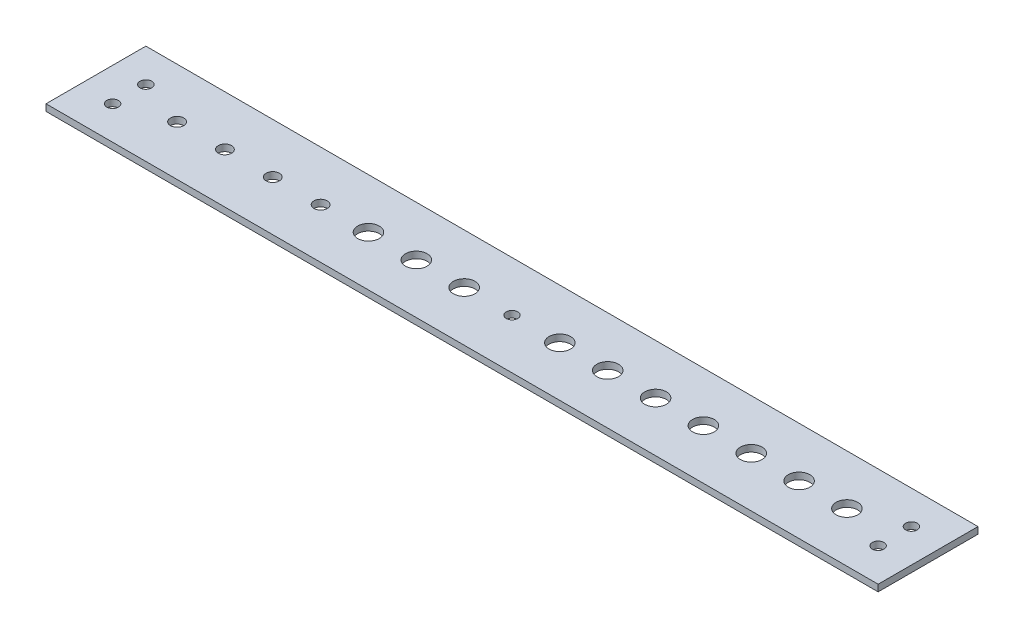
ISO-10303-21;
HEADER;
FILE_DESCRIPTION(('STEP AP214'),'2;1');
FILE_NAME('part.step','',(''),(''),'','','');
FILE_SCHEMA(('AUTOMOTIVE_DESIGN { 1 0 10303 214 1 1 1 1 }'));
ENDSEC;
DATA;
#1=APPLICATION_CONTEXT('core data for automotive mechanical design processes');
#2=APPLICATION_PROTOCOL_DEFINITION('international standard','automotive_design',2000,#1);
#3=PRODUCT_CONTEXT('',#1,'mechanical');
#4=PRODUCT('Part','Part','',(#3));
#5=PRODUCT_RELATED_PRODUCT_CATEGORY('part','',(#4));
#6=PRODUCT_DEFINITION_FORMATION('','',#4);
#7=PRODUCT_DEFINITION_CONTEXT('part definition',#1,'design');
#8=PRODUCT_DEFINITION('design','',#6,#7);
#9=PRODUCT_DEFINITION_SHAPE('','',#8);
#10=(LENGTH_UNIT() NAMED_UNIT(*) SI_UNIT(.MILLI.,.METRE.));
#11=(NAMED_UNIT(*) PLANE_ANGLE_UNIT() SI_UNIT($,.RADIAN.));
#12=(NAMED_UNIT(*) SI_UNIT($,.STERADIAN.) SOLID_ANGLE_UNIT());
#13=UNCERTAINTY_MEASURE_WITH_UNIT(LENGTH_MEASURE(1.E-05),#10,'distance_accuracy_value','');
#14=(GEOMETRIC_REPRESENTATION_CONTEXT(3) GLOBAL_UNCERTAINTY_ASSIGNED_CONTEXT((#13)) GLOBAL_UNIT_ASSIGNED_CONTEXT((#10,
#11,#12)) REPRESENTATION_CONTEXT('',''));
#15=CARTESIAN_POINT('',(0.,0.,0.));
#16=DIRECTION('',(0.,0.,1.));
#17=DIRECTION('',(1.,0.,0.));
#18=AXIS2_PLACEMENT_3D('',#15,#16,#17);
#19=CARTESIAN_POINT('',(-125.,2.,-15.));
#20=DIRECTION('',(0.,1.,0.));
#21=DIRECTION('',(0.,0.,1.));
#22=AXIS2_PLACEMENT_3D('',#19,#20,#21);
#23=PLANE('',#22);
#24=CARTESIAN_POINT('',(-14.375,2.,0.));
#25=DIRECTION('',(0.,1.,0.));
#26=DIRECTION('',(0.,0.,1.));
#27=AXIS2_PLACEMENT_3D('',#24,#25,#26);
#28=CIRCLE('',#27,3.25);
#29=CARTESIAN_POINT('',(-14.375,2.,3.25));
#30=VERTEX_POINT('',#29);
#31=EDGE_CURVE('E213',#30,#30,#28,.T.);
#32=ORIENTED_EDGE('',*,*,#31,.F.);
#33=EDGE_LOOP('',(#32));
#34=FACE_BOUND('',#33,.T.);
#35=CARTESIAN_POINT('',(-86.25,2.,0.));
#36=DIRECTION('',(0.,1.,0.));
#37=DIRECTION('',(0.,0.,1.));
#38=AXIS2_PLACEMENT_3D('',#35,#36,#37);
#39=CIRCLE('',#38,2.);
#40=CARTESIAN_POINT('',(-86.25,2.,2.));
#41=VERTEX_POINT('',#40);
#42=EDGE_CURVE('E201',#41,#41,#39,.T.);
#43=ORIENTED_EDGE('',*,*,#42,.F.);
#44=EDGE_LOOP('',(#43));
#45=FACE_BOUND('',#44,.T.);
#46=CARTESIAN_POINT('',(100.625,2.,0.));
#47=DIRECTION('',(0.,1.,0.));
#48=DIRECTION('',(0.,0.,1.));
#49=AXIS2_PLACEMENT_3D('',#46,#47,#48);
#50=CIRCLE('',#49,3.25000000000001);
#51=CARTESIAN_POINT('',(100.625,2.,3.25000000000001));
#52=VERTEX_POINT('',#51);
#53=EDGE_CURVE('E189',#52,#52,#50,.T.);
#54=ORIENTED_EDGE('',*,*,#53,.F.);
#55=EDGE_LOOP('',(#54));
#56=FACE_BOUND('',#55,.T.);
#57=CARTESIAN_POINT('',(71.875,2.,0.));
#58=DIRECTION('',(0.,1.,0.));
#59=DIRECTION('',(0.,0.,1.));
#60=AXIS2_PLACEMENT_3D('',#57,#58,#59);
#61=CIRCLE('',#60,3.25000000000001);
#62=CARTESIAN_POINT('',(71.875,2.,3.25000000000001));
#63=VERTEX_POINT('',#62);
#64=EDGE_CURVE('E177',#63,#63,#61,.T.);
#65=ORIENTED_EDGE('',*,*,#64,.F.);
#66=EDGE_LOOP('',(#65));
#67=FACE_BOUND('',#66,.T.);
#68=CARTESIAN_POINT('',(43.125,2.,0.));
#69=DIRECTION('',(0.,1.,0.));
#70=DIRECTION('',(0.,0.,1.));
#71=AXIS2_PLACEMENT_3D('',#68,#69,#70);
#72=CIRCLE('',#71,3.25);
#73=CARTESIAN_POINT('',(43.125,2.,3.25));
#74=VERTEX_POINT('',#73);
#75=EDGE_CURVE('E165',#74,#74,#72,.T.);
#76=ORIENTED_EDGE('',*,*,#75,.F.);
#77=EDGE_LOOP('',(#76));
#78=FACE_BOUND('',#77,.T.);
#79=CARTESIAN_POINT('',(-57.5,2.,0.));
#80=DIRECTION('',(0.,1.,0.));
#81=DIRECTION('',(0.,0.,1.));
#82=AXIS2_PLACEMENT_3D('',#79,#80,#81);
#83=CIRCLE('',#82,2.);
#84=CARTESIAN_POINT('',(-57.5,2.,2.));
#85=VERTEX_POINT('',#84);
#86=EDGE_CURVE('E153',#85,#85,#83,.T.);
#87=ORIENTED_EDGE('',*,*,#86,.F.);
#88=EDGE_LOOP('',(#87));
#89=FACE_BOUND('',#88,.T.);
#90=CARTESIAN_POINT('',(-100.625,2.,0.));
#91=DIRECTION('',(0.,1.,0.));
#92=DIRECTION('',(0.,0.,1.));
#93=AXIS2_PLACEMENT_3D('',#90,#91,#92);
#94=CIRCLE('',#93,2.);
#95=CARTESIAN_POINT('',(-100.625,2.,2.));
#96=VERTEX_POINT('',#95);
#97=EDGE_CURVE('E141',#96,#96,#94,.T.);
#98=ORIENTED_EDGE('',*,*,#97,.F.);
#99=EDGE_LOOP('',(#98));
#100=FACE_BOUND('',#99,.T.);
#101=CARTESIAN_POINT('',(115.,2.,-4.99999999999998));
#102=DIRECTION('',(0.,1.,0.));
#103=DIRECTION('',(0.,0.,1.));
#104=AXIS2_PLACEMENT_3D('',#101,#102,#103);
#105=CIRCLE('',#104,1.75);
#106=CARTESIAN_POINT('',(115.,2.,-3.24999999999999));
#107=VERTEX_POINT('',#106);
#108=EDGE_CURVE('E129',#107,#107,#105,.T.);
#109=ORIENTED_EDGE('',*,*,#108,.F.);
#110=EDGE_LOOP('',(#109));
#111=FACE_BOUND('',#110,.T.);
#112=CARTESIAN_POINT('',(-115.,2.,5.00000000000002));
#113=DIRECTION('',(0.,1.,0.));
#114=DIRECTION('',(0.,0.,1.));
#115=AXIS2_PLACEMENT_3D('',#112,#113,#114);
#116=CIRCLE('',#115,1.75);
#117=CARTESIAN_POINT('',(-115.,2.,6.75000000000001));
#118=VERTEX_POINT('',#117);
#119=EDGE_CURVE('E117',#118,#118,#116,.T.);
#120=ORIENTED_EDGE('',*,*,#119,.F.);
#121=EDGE_LOOP('',(#120));
#122=FACE_BOUND('',#121,.T.);
#123=DIRECTION('',(0.,0.,1.));
#124=VECTOR('',#123,1.);
#125=CARTESIAN_POINT('',(-125.,2.,15.));
#126=LINE('',#125,#124);
#127=CARTESIAN_POINT('',(-125.,2.,-15.));
#128=VERTEX_POINT('',#127);
#129=CARTESIAN_POINT('',(-125.,2.,15.));
#130=VERTEX_POINT('',#129);
#131=EDGE_CURVE('E87',#128,#130,#126,.T.);
#132=ORIENTED_EDGE('',*,*,#131,.T.);
#133=DIRECTION('',(1.,0.,0.));
#134=VECTOR('',#133,1.);
#135=CARTESIAN_POINT('',(125.,2.,15.));
#136=LINE('',#135,#134);
#137=CARTESIAN_POINT('',(125.,2.,15.));
#138=VERTEX_POINT('',#137);
#139=EDGE_CURVE('E82',#130,#138,#136,.T.);
#140=ORIENTED_EDGE('',*,*,#139,.T.);
#141=DIRECTION('',(0.,0.,-1.));
#142=VECTOR('',#141,1.);
#143=CARTESIAN_POINT('',(125.,2.,15.));
#144=LINE('',#143,#142);
#145=CARTESIAN_POINT('',(125.,2.,-15.));
#146=VERTEX_POINT('',#145);
#147=EDGE_CURVE('E85',#138,#146,#144,.T.);
#148=ORIENTED_EDGE('',*,*,#147,.T.);
#149=DIRECTION('',(-1.,0.,0.));
#150=VECTOR('',#149,1.);
#151=CARTESIAN_POINT('',(125.,2.,-15.));
#152=LINE('',#151,#150);
#153=EDGE_CURVE('E52',#146,#128,#152,.T.);
#154=ORIENTED_EDGE('',*,*,#153,.T.);
#155=EDGE_LOOP('',(#132,#140,#148,#154));
#156=FACE_BOUND('',#155,.T.);
#157=CARTESIAN_POINT('',(-115.,2.,-4.99999999999998));
#158=DIRECTION('',(0.,1.,0.));
#159=DIRECTION('',(0.,0.,1.));
#160=AXIS2_PLACEMENT_3D('',#157,#158,#159);
#161=CIRCLE('',#160,1.75);
#162=CARTESIAN_POINT('',(-115.,2.,-3.24999999999999));
#163=VERTEX_POINT('',#162);
#164=EDGE_CURVE('E102',#163,#163,#161,.T.);
#165=ORIENTED_EDGE('',*,*,#164,.F.);
#166=EDGE_LOOP('',(#165));
#167=FACE_BOUND('',#166,.T.);
#168=CARTESIAN_POINT('',(0.,2.,0.));
#169=DIRECTION('',(0.,1.,0.));
#170=DIRECTION('',(0.,0.,1.));
#171=AXIS2_PLACEMENT_3D('',#168,#169,#170);
#172=CIRCLE('',#171,1.75);
#173=CARTESIAN_POINT('',(0.,2.,1.75));
#174=VERTEX_POINT('',#173);
#175=EDGE_CURVE('E123',#174,#174,#172,.T.);
#176=ORIENTED_EDGE('',*,*,#175,.F.);
#177=EDGE_LOOP('',(#176));
#178=FACE_BOUND('',#177,.T.);
#179=CARTESIAN_POINT('',(115.,2.,5.00000000000002));
#180=DIRECTION('',(0.,1.,0.));
#181=DIRECTION('',(0.,0.,1.));
#182=AXIS2_PLACEMENT_3D('',#179,#180,#181);
#183=CIRCLE('',#182,1.75);
#184=CARTESIAN_POINT('',(115.,2.,6.75000000000001));
#185=VERTEX_POINT('',#184);
#186=EDGE_CURVE('E135',#185,#185,#183,.T.);
#187=ORIENTED_EDGE('',*,*,#186,.F.);
#188=EDGE_LOOP('',(#187));
#189=FACE_BOUND('',#188,.T.);
#190=CARTESIAN_POINT('',(-71.875,2.,0.));
#191=DIRECTION('',(0.,1.,0.));
#192=DIRECTION('',(0.,0.,1.));
#193=AXIS2_PLACEMENT_3D('',#190,#191,#192);
#194=CIRCLE('',#193,2.);
#195=CARTESIAN_POINT('',(-71.875,2.,2.));
#196=VERTEX_POINT('',#195);
#197=EDGE_CURVE('E147',#196,#196,#194,.T.);
#198=ORIENTED_EDGE('',*,*,#197,.F.);
#199=EDGE_LOOP('',(#198));
#200=FACE_BOUND('',#199,.T.);
#201=CARTESIAN_POINT('',(14.375,2.,0.));
#202=DIRECTION('',(0.,1.,0.));
#203=DIRECTION('',(0.,0.,1.));
#204=AXIS2_PLACEMENT_3D('',#201,#202,#203);
#205=CIRCLE('',#204,3.25);
#206=CARTESIAN_POINT('',(14.375,2.,3.25));
#207=VERTEX_POINT('',#206);
#208=EDGE_CURVE('E159',#207,#207,#205,.T.);
#209=ORIENTED_EDGE('',*,*,#208,.F.);
#210=EDGE_LOOP('',(#209));
#211=FACE_BOUND('',#210,.T.);
#212=CARTESIAN_POINT('',(57.5,2.,0.));
#213=DIRECTION('',(0.,1.,0.));
#214=DIRECTION('',(0.,0.,1.));
#215=AXIS2_PLACEMENT_3D('',#212,#213,#214);
#216=CIRCLE('',#215,3.25000000000001);
#217=CARTESIAN_POINT('',(57.5,2.,3.25000000000001));
#218=VERTEX_POINT('',#217);
#219=EDGE_CURVE('E171',#218,#218,#216,.T.);
#220=ORIENTED_EDGE('',*,*,#219,.F.);
#221=EDGE_LOOP('',(#220));
#222=FACE_BOUND('',#221,.T.);
#223=CARTESIAN_POINT('',(86.25,2.,0.));
#224=DIRECTION('',(0.,1.,0.));
#225=DIRECTION('',(0.,0.,1.));
#226=AXIS2_PLACEMENT_3D('',#223,#224,#225);
#227=CIRCLE('',#226,3.25000000000001);
#228=CARTESIAN_POINT('',(86.25,2.,3.25000000000001));
#229=VERTEX_POINT('',#228);
#230=EDGE_CURVE('E183',#229,#229,#227,.T.);
#231=ORIENTED_EDGE('',*,*,#230,.F.);
#232=EDGE_LOOP('',(#231));
#233=FACE_BOUND('',#232,.T.);
#234=CARTESIAN_POINT('',(-43.125,2.,0.));
#235=DIRECTION('',(0.,1.,0.));
#236=DIRECTION('',(0.,0.,1.));
#237=AXIS2_PLACEMENT_3D('',#234,#235,#236);
#238=CIRCLE('',#237,3.25);
#239=CARTESIAN_POINT('',(-43.125,2.,3.25));
#240=VERTEX_POINT('',#239);
#241=EDGE_CURVE('E195',#240,#240,#238,.T.);
#242=ORIENTED_EDGE('',*,*,#241,.F.);
#243=EDGE_LOOP('',(#242));
#244=FACE_BOUND('',#243,.T.);
#245=CARTESIAN_POINT('',(-28.75,2.,0.));
#246=DIRECTION('',(0.,1.,0.));
#247=DIRECTION('',(0.,0.,1.));
#248=AXIS2_PLACEMENT_3D('',#245,#246,#247);
#249=CIRCLE('',#248,3.25);
#250=CARTESIAN_POINT('',(-28.75,2.,3.25));
#251=VERTEX_POINT('',#250);
#252=EDGE_CURVE('E207',#251,#251,#249,.T.);
#253=ORIENTED_EDGE('',*,*,#252,.F.);
#254=EDGE_LOOP('',(#253));
#255=FACE_BOUND('',#254,.T.);
#256=CARTESIAN_POINT('',(28.75,2.,0.));
#257=DIRECTION('',(0.,1.,0.));
#258=DIRECTION('',(0.,0.,1.));
#259=AXIS2_PLACEMENT_3D('',#256,#257,#258);
#260=CIRCLE('',#259,3.25);
#261=CARTESIAN_POINT('',(28.75,2.,3.25));
#262=VERTEX_POINT('',#261);
#263=EDGE_CURVE('E219',#262,#262,#260,.T.);
#264=ORIENTED_EDGE('',*,*,#263,.F.);
#265=EDGE_LOOP('',(#264));
#266=FACE_BOUND('',#265,.T.);
#267=ADVANCED_FACE('F35',(#34,#45,#56,#67,#78,#89,#100,#111,#122,#156,#167,#178,#189,#200,#211,
#222,#233,#244,#255,#266),#23,.T.);
#268=CARTESIAN_POINT('',(-125.,0.,-15.));
#269=DIRECTION('',(0.,1.,0.));
#270=DIRECTION('',(0.,0.,1.));
#271=AXIS2_PLACEMENT_3D('',#268,#269,#270);
#272=PLANE('',#271);
#273=CARTESIAN_POINT('',(-14.375,0.,0.));
#274=DIRECTION('',(0.,1.,0.));
#275=DIRECTION('',(0.,0.,1.));
#276=AXIS2_PLACEMENT_3D('',#273,#274,#275);
#277=CIRCLE('',#276,3.25);
#278=CARTESIAN_POINT('',(-14.375,0.,3.25));
#279=VERTEX_POINT('',#278);
#280=EDGE_CURVE('E216',#279,#279,#277,.T.);
#281=ORIENTED_EDGE('',*,*,#280,.T.);
#282=EDGE_LOOP('',(#281));
#283=FACE_BOUND('',#282,.T.);
#284=CARTESIAN_POINT('',(-86.25,0.,0.));
#285=DIRECTION('',(0.,1.,0.));
#286=DIRECTION('',(0.,0.,1.));
#287=AXIS2_PLACEMENT_3D('',#284,#285,#286);
#288=CIRCLE('',#287,2.);
#289=CARTESIAN_POINT('',(-86.25,0.,2.));
#290=VERTEX_POINT('',#289);
#291=EDGE_CURVE('E204',#290,#290,#288,.T.);
#292=ORIENTED_EDGE('',*,*,#291,.T.);
#293=EDGE_LOOP('',(#292));
#294=FACE_BOUND('',#293,.T.);
#295=CARTESIAN_POINT('',(100.625,0.,0.));
#296=DIRECTION('',(0.,1.,0.));
#297=DIRECTION('',(0.,0.,1.));
#298=AXIS2_PLACEMENT_3D('',#295,#296,#297);
#299=CIRCLE('',#298,3.25000000000001);
#300=CARTESIAN_POINT('',(100.625,0.,3.25000000000001));
#301=VERTEX_POINT('',#300);
#302=EDGE_CURVE('E192',#301,#301,#299,.T.);
#303=ORIENTED_EDGE('',*,*,#302,.T.);
#304=EDGE_LOOP('',(#303));
#305=FACE_BOUND('',#304,.T.);
#306=CARTESIAN_POINT('',(71.875,0.,0.));
#307=DIRECTION('',(0.,1.,0.));
#308=DIRECTION('',(0.,0.,1.));
#309=AXIS2_PLACEMENT_3D('',#306,#307,#308);
#310=CIRCLE('',#309,3.25000000000001);
#311=CARTESIAN_POINT('',(71.875,0.,3.25000000000001));
#312=VERTEX_POINT('',#311);
#313=EDGE_CURVE('E180',#312,#312,#310,.T.);
#314=ORIENTED_EDGE('',*,*,#313,.T.);
#315=EDGE_LOOP('',(#314));
#316=FACE_BOUND('',#315,.T.);
#317=CARTESIAN_POINT('',(43.125,0.,0.));
#318=DIRECTION('',(0.,1.,0.));
#319=DIRECTION('',(0.,0.,1.));
#320=AXIS2_PLACEMENT_3D('',#317,#318,#319);
#321=CIRCLE('',#320,3.25);
#322=CARTESIAN_POINT('',(43.125,0.,3.25));
#323=VERTEX_POINT('',#322);
#324=EDGE_CURVE('E168',#323,#323,#321,.T.);
#325=ORIENTED_EDGE('',*,*,#324,.T.);
#326=EDGE_LOOP('',(#325));
#327=FACE_BOUND('',#326,.T.);
#328=CARTESIAN_POINT('',(-57.5,0.,0.));
#329=DIRECTION('',(0.,1.,0.));
#330=DIRECTION('',(0.,0.,1.));
#331=AXIS2_PLACEMENT_3D('',#328,#329,#330);
#332=CIRCLE('',#331,2.);
#333=CARTESIAN_POINT('',(-57.5,0.,2.));
#334=VERTEX_POINT('',#333);
#335=EDGE_CURVE('E156',#334,#334,#332,.T.);
#336=ORIENTED_EDGE('',*,*,#335,.T.);
#337=EDGE_LOOP('',(#336));
#338=FACE_BOUND('',#337,.T.);
#339=CARTESIAN_POINT('',(-100.625,0.,0.));
#340=DIRECTION('',(0.,1.,0.));
#341=DIRECTION('',(0.,0.,1.));
#342=AXIS2_PLACEMENT_3D('',#339,#340,#341);
#343=CIRCLE('',#342,2.);
#344=CARTESIAN_POINT('',(-100.625,0.,2.));
#345=VERTEX_POINT('',#344);
#346=EDGE_CURVE('E144',#345,#345,#343,.T.);
#347=ORIENTED_EDGE('',*,*,#346,.T.);
#348=EDGE_LOOP('',(#347));
#349=FACE_BOUND('',#348,.T.);
#350=CARTESIAN_POINT('',(115.,0.,-4.99999999999998));
#351=DIRECTION('',(0.,1.,0.));
#352=DIRECTION('',(0.,0.,1.));
#353=AXIS2_PLACEMENT_3D('',#350,#351,#352);
#354=CIRCLE('',#353,1.75);
#355=CARTESIAN_POINT('',(115.,0.,-3.24999999999999));
#356=VERTEX_POINT('',#355);
#357=EDGE_CURVE('E132',#356,#356,#354,.T.);
#358=ORIENTED_EDGE('',*,*,#357,.T.);
#359=EDGE_LOOP('',(#358));
#360=FACE_BOUND('',#359,.T.);
#361=CARTESIAN_POINT('',(-115.,0.,5.00000000000002));
#362=DIRECTION('',(0.,1.,0.));
#363=DIRECTION('',(0.,0.,1.));
#364=AXIS2_PLACEMENT_3D('',#361,#362,#363);
#365=CIRCLE('',#364,1.75);
#366=CARTESIAN_POINT('',(-115.,0.,6.75000000000001));
#367=VERTEX_POINT('',#366);
#368=EDGE_CURVE('E120',#367,#367,#365,.T.);
#369=ORIENTED_EDGE('',*,*,#368,.T.);
#370=EDGE_LOOP('',(#369));
#371=FACE_BOUND('',#370,.T.);
#372=DIRECTION('',(0.,0.,1.));
#373=VECTOR('',#372,1.);
#374=CARTESIAN_POINT('',(-125.,0.,15.));
#375=LINE('',#374,#373);
#376=CARTESIAN_POINT('',(-125.,0.,-15.));
#377=VERTEX_POINT('',#376);
#378=CARTESIAN_POINT('',(-125.,0.,15.));
#379=VERTEX_POINT('',#378);
#380=EDGE_CURVE('E99',#377,#379,#375,.T.);
#381=ORIENTED_EDGE('',*,*,#380,.F.);
#382=DIRECTION('',(-1.,0.,0.));
#383=VECTOR('',#382,1.);
#384=CARTESIAN_POINT('',(125.,0.,-15.));
#385=LINE('',#384,#383);
#386=CARTESIAN_POINT('',(125.,0.,-15.));
#387=VERTEX_POINT('',#386);
#388=EDGE_CURVE('E75',#387,#377,#385,.T.);
#389=ORIENTED_EDGE('',*,*,#388,.F.);
#390=DIRECTION('',(0.,0.,-1.));
#391=VECTOR('',#390,1.);
#392=CARTESIAN_POINT('',(125.,0.,15.));
#393=LINE('',#392,#391);
#394=CARTESIAN_POINT('',(125.,0.,15.));
#395=VERTEX_POINT('',#394);
#396=EDGE_CURVE('E69',#395,#387,#393,.T.);
#397=ORIENTED_EDGE('',*,*,#396,.F.);
#398=DIRECTION('',(1.,0.,0.));
#399=VECTOR('',#398,1.);
#400=CARTESIAN_POINT('',(125.,0.,15.));
#401=LINE('',#400,#399);
#402=EDGE_CURVE('E91',#379,#395,#401,.T.);
#403=ORIENTED_EDGE('',*,*,#402,.F.);
#404=EDGE_LOOP('',(#381,#389,#397,#403));
#405=FACE_BOUND('',#404,.T.);
#406=CARTESIAN_POINT('',(-115.,0.,-4.99999999999998));
#407=DIRECTION('',(0.,1.,0.));
#408=DIRECTION('',(0.,0.,1.));
#409=AXIS2_PLACEMENT_3D('',#406,#407,#408);
#410=CIRCLE('',#409,1.75);
#411=CARTESIAN_POINT('',(-115.,0.,-3.24999999999999));
#412=VERTEX_POINT('',#411);
#413=EDGE_CURVE('E114',#412,#412,#410,.T.);
#414=ORIENTED_EDGE('',*,*,#413,.T.);
#415=EDGE_LOOP('',(#414));
#416=FACE_BOUND('',#415,.T.);
#417=CARTESIAN_POINT('',(0.,0.,0.));
#418=DIRECTION('',(0.,1.,0.));
#419=DIRECTION('',(0.,0.,1.));
#420=AXIS2_PLACEMENT_3D('',#417,#418,#419);
#421=CIRCLE('',#420,1.75);
#422=CARTESIAN_POINT('',(0.,0.,1.75));
#423=VERTEX_POINT('',#422);
#424=EDGE_CURVE('E126',#423,#423,#421,.T.);
#425=ORIENTED_EDGE('',*,*,#424,.T.);
#426=EDGE_LOOP('',(#425));
#427=FACE_BOUND('',#426,.T.);
#428=CARTESIAN_POINT('',(115.,0.,5.00000000000002));
#429=DIRECTION('',(0.,1.,0.));
#430=DIRECTION('',(0.,0.,1.));
#431=AXIS2_PLACEMENT_3D('',#428,#429,#430);
#432=CIRCLE('',#431,1.75);
#433=CARTESIAN_POINT('',(115.,0.,6.75000000000001));
#434=VERTEX_POINT('',#433);
#435=EDGE_CURVE('E138',#434,#434,#432,.T.);
#436=ORIENTED_EDGE('',*,*,#435,.T.);
#437=EDGE_LOOP('',(#436));
#438=FACE_BOUND('',#437,.T.);
#439=CARTESIAN_POINT('',(-71.875,0.,0.));
#440=DIRECTION('',(0.,1.,0.));
#441=DIRECTION('',(0.,0.,1.));
#442=AXIS2_PLACEMENT_3D('',#439,#440,#441);
#443=CIRCLE('',#442,2.);
#444=CARTESIAN_POINT('',(-71.875,0.,2.));
#445=VERTEX_POINT('',#444);
#446=EDGE_CURVE('E150',#445,#445,#443,.T.);
#447=ORIENTED_EDGE('',*,*,#446,.T.);
#448=EDGE_LOOP('',(#447));
#449=FACE_BOUND('',#448,.T.);
#450=CARTESIAN_POINT('',(14.375,0.,0.));
#451=DIRECTION('',(0.,1.,0.));
#452=DIRECTION('',(0.,0.,1.));
#453=AXIS2_PLACEMENT_3D('',#450,#451,#452);
#454=CIRCLE('',#453,3.25);
#455=CARTESIAN_POINT('',(14.375,0.,3.25));
#456=VERTEX_POINT('',#455);
#457=EDGE_CURVE('E162',#456,#456,#454,.T.);
#458=ORIENTED_EDGE('',*,*,#457,.T.);
#459=EDGE_LOOP('',(#458));
#460=FACE_BOUND('',#459,.T.);
#461=CARTESIAN_POINT('',(57.5,0.,0.));
#462=DIRECTION('',(0.,1.,0.));
#463=DIRECTION('',(0.,0.,1.));
#464=AXIS2_PLACEMENT_3D('',#461,#462,#463);
#465=CIRCLE('',#464,3.25000000000001);
#466=CARTESIAN_POINT('',(57.5,0.,3.25000000000001));
#467=VERTEX_POINT('',#466);
#468=EDGE_CURVE('E174',#467,#467,#465,.T.);
#469=ORIENTED_EDGE('',*,*,#468,.T.);
#470=EDGE_LOOP('',(#469));
#471=FACE_BOUND('',#470,.T.);
#472=CARTESIAN_POINT('',(86.25,0.,0.));
#473=DIRECTION('',(0.,1.,0.));
#474=DIRECTION('',(0.,0.,1.));
#475=AXIS2_PLACEMENT_3D('',#472,#473,#474);
#476=CIRCLE('',#475,3.25000000000001);
#477=CARTESIAN_POINT('',(86.25,0.,3.25000000000001));
#478=VERTEX_POINT('',#477);
#479=EDGE_CURVE('E186',#478,#478,#476,.T.);
#480=ORIENTED_EDGE('',*,*,#479,.T.);
#481=EDGE_LOOP('',(#480));
#482=FACE_BOUND('',#481,.T.);
#483=CARTESIAN_POINT('',(-43.125,0.,0.));
#484=DIRECTION('',(0.,1.,0.));
#485=DIRECTION('',(0.,0.,1.));
#486=AXIS2_PLACEMENT_3D('',#483,#484,#485);
#487=CIRCLE('',#486,3.25);
#488=CARTESIAN_POINT('',(-43.125,0.,3.25));
#489=VERTEX_POINT('',#488);
#490=EDGE_CURVE('E198',#489,#489,#487,.T.);
#491=ORIENTED_EDGE('',*,*,#490,.T.);
#492=EDGE_LOOP('',(#491));
#493=FACE_BOUND('',#492,.T.);
#494=CARTESIAN_POINT('',(-28.75,0.,0.));
#495=DIRECTION('',(0.,1.,0.));
#496=DIRECTION('',(0.,0.,1.));
#497=AXIS2_PLACEMENT_3D('',#494,#495,#496);
#498=CIRCLE('',#497,3.25);
#499=CARTESIAN_POINT('',(-28.75,0.,3.25));
#500=VERTEX_POINT('',#499);
#501=EDGE_CURVE('E210',#500,#500,#498,.T.);
#502=ORIENTED_EDGE('',*,*,#501,.T.);
#503=EDGE_LOOP('',(#502));
#504=FACE_BOUND('',#503,.T.);
#505=CARTESIAN_POINT('',(28.75,0.,0.));
#506=DIRECTION('',(0.,1.,0.));
#507=DIRECTION('',(0.,0.,1.));
#508=AXIS2_PLACEMENT_3D('',#505,#506,#507);
#509=CIRCLE('',#508,3.25);
#510=CARTESIAN_POINT('',(28.75,0.,3.25));
#511=VERTEX_POINT('',#510);
#512=EDGE_CURVE('E222',#511,#511,#509,.T.);
#513=ORIENTED_EDGE('',*,*,#512,.T.);
#514=EDGE_LOOP('',(#513));
#515=FACE_BOUND('',#514,.T.);
#516=ADVANCED_FACE('F110',(#283,#294,#305,#316,#327,#338,#349,#360,#371,#405,#416,#427,#438,
#449,#460,#471,#482,#493,#504,#515),#272,.F.);
#517=CARTESIAN_POINT('',(-125.,2.,15.));
#518=DIRECTION('',(1.,0.,0.));
#519=DIRECTION('',(0.,0.,-1.));
#520=AXIS2_PLACEMENT_3D('',#517,#518,#519);
#521=PLANE('',#520);
#522=ORIENTED_EDGE('',*,*,#380,.T.);
#523=DIRECTION('',(0.,-1.,0.));
#524=VECTOR('',#523,1.);
#525=CARTESIAN_POINT('',(-125.,2.,15.));
#526=LINE('',#525,#524);
#527=EDGE_CURVE('E11',#130,#379,#526,.T.);
#528=ORIENTED_EDGE('',*,*,#527,.F.);
#529=ORIENTED_EDGE('',*,*,#131,.F.);
#530=DIRECTION('',(0.,-1.,0.));
#531=VECTOR('',#530,1.);
#532=CARTESIAN_POINT('',(-125.,2.,-15.));
#533=LINE('',#532,#531);
#534=EDGE_CURVE('E95',#128,#377,#533,.T.);
#535=ORIENTED_EDGE('',*,*,#534,.T.);
#536=EDGE_LOOP('',(#522,#528,#529,#535));
#537=FACE_BOUND('',#536,.T.);
#538=ADVANCED_FACE('F37',(#537),#521,.F.);
#539=CARTESIAN_POINT('',(125.,2.,15.));
#540=DIRECTION('',(0.,0.,-1.));
#541=DIRECTION('',(-1.,0.,0.));
#542=AXIS2_PLACEMENT_3D('',#539,#540,#541);
#543=PLANE('',#542);
#544=ORIENTED_EDGE('',*,*,#402,.T.);
#545=DIRECTION('',(0.,-1.,0.));
#546=VECTOR('',#545,1.);
#547=CARTESIAN_POINT('',(125.,2.,15.));
#548=LINE('',#547,#546);
#549=EDGE_CURVE('E44',#138,#395,#548,.T.);
#550=ORIENTED_EDGE('',*,*,#549,.F.);
#551=ORIENTED_EDGE('',*,*,#139,.F.);
#552=ORIENTED_EDGE('',*,*,#527,.T.);
#553=EDGE_LOOP('',(#544,#550,#551,#552));
#554=FACE_BOUND('',#553,.T.);
#555=ADVANCED_FACE('F90',(#554),#543,.F.);
#556=CARTESIAN_POINT('',(125.,2.,15.));
#557=DIRECTION('',(-1.,0.,0.));
#558=DIRECTION('',(0.,0.,1.));
#559=AXIS2_PLACEMENT_3D('',#556,#557,#558);
#560=PLANE('',#559);
#561=ORIENTED_EDGE('',*,*,#396,.T.);
#562=DIRECTION('',(0.,-1.,0.));
#563=VECTOR('',#562,1.);
#564=CARTESIAN_POINT('',(125.,2.,-15.));
#565=LINE('',#564,#563);
#566=EDGE_CURVE('E92',#146,#387,#565,.T.);
#567=ORIENTED_EDGE('',*,*,#566,.F.);
#568=ORIENTED_EDGE('',*,*,#147,.F.);
#569=ORIENTED_EDGE('',*,*,#549,.T.);
#570=EDGE_LOOP('',(#561,#567,#568,#569));
#571=FACE_BOUND('',#570,.T.);
#572=ADVANCED_FACE('F93',(#571),#560,.F.);
#573=CARTESIAN_POINT('',(125.,2.,-15.));
#574=DIRECTION('',(0.,0.,1.));
#575=DIRECTION('',(1.,0.,0.));
#576=AXIS2_PLACEMENT_3D('',#573,#574,#575);
#577=PLANE('',#576);
#578=ORIENTED_EDGE('',*,*,#388,.T.);
#579=ORIENTED_EDGE('',*,*,#534,.F.);
#580=ORIENTED_EDGE('',*,*,#153,.F.);
#581=ORIENTED_EDGE('',*,*,#566,.T.);
#582=EDGE_LOOP('',(#578,#579,#580,#581));
#583=FACE_BOUND('',#582,.T.);
#584=ADVANCED_FACE('F107',(#583),#577,.F.);
#585=CARTESIAN_POINT('',(-115.,2.,-4.99999999999998));
#586=DIRECTION('',(0.,-1.,0.));
#587=DIRECTION('',(0.,0.,-1.));
#588=AXIS2_PLACEMENT_3D('',#585,#586,#587);
#589=CYLINDRICAL_SURFACE('',#588,1.75);
#590=ORIENTED_EDGE('',*,*,#164,.T.);
#591=EDGE_LOOP('',(#590));
#592=FACE_BOUND('',#591,.T.);
#593=ORIENTED_EDGE('',*,*,#413,.F.);
#594=EDGE_LOOP('',(#593));
#595=FACE_BOUND('',#594,.T.);
#596=ADVANCED_FACE('F242',(#592,#595),#589,.F.);
#597=CARTESIAN_POINT('',(-115.,2.,5.00000000000002));
#598=DIRECTION('',(0.,-1.,0.));
#599=DIRECTION('',(0.,0.,-1.));
#600=AXIS2_PLACEMENT_3D('',#597,#598,#599);
#601=CYLINDRICAL_SURFACE('',#600,1.75);
#602=ORIENTED_EDGE('',*,*,#119,.T.);
#603=EDGE_LOOP('',(#602));
#604=FACE_BOUND('',#603,.T.);
#605=ORIENTED_EDGE('',*,*,#368,.F.);
#606=EDGE_LOOP('',(#605));
#607=FACE_BOUND('',#606,.T.);
#608=ADVANCED_FACE('F288',(#604,#607),#601,.F.);
#609=CARTESIAN_POINT('',(0.,2.,0.));
#610=DIRECTION('',(0.,-1.,0.));
#611=DIRECTION('',(0.,0.,-1.));
#612=AXIS2_PLACEMENT_3D('',#609,#610,#611);
#613=CYLINDRICAL_SURFACE('',#612,1.75);
#614=ORIENTED_EDGE('',*,*,#175,.T.);
#615=EDGE_LOOP('',(#614));
#616=FACE_BOUND('',#615,.T.);
#617=ORIENTED_EDGE('',*,*,#424,.F.);
#618=EDGE_LOOP('',(#617));
#619=FACE_BOUND('',#618,.T.);
#620=ADVANCED_FACE('F296',(#616,#619),#613,.F.);
#621=CARTESIAN_POINT('',(115.,2.,-4.99999999999998));
#622=DIRECTION('',(0.,-1.,0.));
#623=DIRECTION('',(0.,0.,-1.));
#624=AXIS2_PLACEMENT_3D('',#621,#622,#623);
#625=CYLINDRICAL_SURFACE('',#624,1.75);
#626=ORIENTED_EDGE('',*,*,#108,.T.);
#627=EDGE_LOOP('',(#626));
#628=FACE_BOUND('',#627,.T.);
#629=ORIENTED_EDGE('',*,*,#357,.F.);
#630=EDGE_LOOP('',(#629));
#631=FACE_BOUND('',#630,.T.);
#632=ADVANCED_FACE('F304',(#628,#631),#625,.F.);
#633=CARTESIAN_POINT('',(115.,2.,5.00000000000002));
#634=DIRECTION('',(0.,-1.,0.));
#635=DIRECTION('',(0.,0.,-1.));
#636=AXIS2_PLACEMENT_3D('',#633,#634,#635);
#637=CYLINDRICAL_SURFACE('',#636,1.75);
#638=ORIENTED_EDGE('',*,*,#186,.T.);
#639=EDGE_LOOP('',(#638));
#640=FACE_BOUND('',#639,.T.);
#641=ORIENTED_EDGE('',*,*,#435,.F.);
#642=EDGE_LOOP('',(#641));
#643=FACE_BOUND('',#642,.T.);
#644=ADVANCED_FACE('F313',(#640,#643),#637,.F.);
#645=CARTESIAN_POINT('',(-100.625,2.,0.));
#646=DIRECTION('',(0.,-1.,0.));
#647=DIRECTION('',(0.,0.,-1.));
#648=AXIS2_PLACEMENT_3D('',#645,#646,#647);
#649=CYLINDRICAL_SURFACE('',#648,2.);
#650=ORIENTED_EDGE('',*,*,#97,.T.);
#651=EDGE_LOOP('',(#650));
#652=FACE_BOUND('',#651,.T.);
#653=ORIENTED_EDGE('',*,*,#346,.F.);
#654=EDGE_LOOP('',(#653));
#655=FACE_BOUND('',#654,.T.);
#656=ADVANCED_FACE('F322',(#652,#655),#649,.F.);
#657=CARTESIAN_POINT('',(-71.875,2.,0.));
#658=DIRECTION('',(0.,-1.,0.));
#659=DIRECTION('',(0.,0.,-1.));
#660=AXIS2_PLACEMENT_3D('',#657,#658,#659);
#661=CYLINDRICAL_SURFACE('',#660,2.);
#662=ORIENTED_EDGE('',*,*,#197,.T.);
#663=EDGE_LOOP('',(#662));
#664=FACE_BOUND('',#663,.T.);
#665=ORIENTED_EDGE('',*,*,#446,.F.);
#666=EDGE_LOOP('',(#665));
#667=FACE_BOUND('',#666,.T.);
#668=ADVANCED_FACE('F331',(#664,#667),#661,.F.);
#669=CARTESIAN_POINT('',(-57.5,2.,0.));
#670=DIRECTION('',(0.,-1.,0.));
#671=DIRECTION('',(0.,0.,-1.));
#672=AXIS2_PLACEMENT_3D('',#669,#670,#671);
#673=CYLINDRICAL_SURFACE('',#672,2.);
#674=ORIENTED_EDGE('',*,*,#86,.T.);
#675=EDGE_LOOP('',(#674));
#676=FACE_BOUND('',#675,.T.);
#677=ORIENTED_EDGE('',*,*,#335,.F.);
#678=EDGE_LOOP('',(#677));
#679=FACE_BOUND('',#678,.T.);
#680=ADVANCED_FACE('F340',(#676,#679),#673,.F.);
#681=CARTESIAN_POINT('',(14.375,2.,0.));
#682=DIRECTION('',(0.,-1.,0.));
#683=DIRECTION('',(0.,0.,-1.));
#684=AXIS2_PLACEMENT_3D('',#681,#682,#683);
#685=CYLINDRICAL_SURFACE('',#684,3.25);
#686=ORIENTED_EDGE('',*,*,#208,.T.);
#687=EDGE_LOOP('',(#686));
#688=FACE_BOUND('',#687,.T.);
#689=ORIENTED_EDGE('',*,*,#457,.F.);
#690=EDGE_LOOP('',(#689));
#691=FACE_BOUND('',#690,.T.);
#692=ADVANCED_FACE('F349',(#688,#691),#685,.F.);
#693=CARTESIAN_POINT('',(43.125,2.,0.));
#694=DIRECTION('',(0.,-1.,0.));
#695=DIRECTION('',(0.,0.,-1.));
#696=AXIS2_PLACEMENT_3D('',#693,#694,#695);
#697=CYLINDRICAL_SURFACE('',#696,3.25);
#698=ORIENTED_EDGE('',*,*,#75,.T.);
#699=EDGE_LOOP('',(#698));
#700=FACE_BOUND('',#699,.T.);
#701=ORIENTED_EDGE('',*,*,#324,.F.);
#702=EDGE_LOOP('',(#701));
#703=FACE_BOUND('',#702,.T.);
#704=ADVANCED_FACE('F358',(#700,#703),#697,.F.);
#705=CARTESIAN_POINT('',(57.5,2.,0.));
#706=DIRECTION('',(0.,-1.,0.));
#707=DIRECTION('',(0.,0.,-1.));
#708=AXIS2_PLACEMENT_3D('',#705,#706,#707);
#709=CYLINDRICAL_SURFACE('',#708,3.25000000000001);
#710=ORIENTED_EDGE('',*,*,#219,.T.);
#711=EDGE_LOOP('',(#710));
#712=FACE_BOUND('',#711,.T.);
#713=ORIENTED_EDGE('',*,*,#468,.F.);
#714=EDGE_LOOP('',(#713));
#715=FACE_BOUND('',#714,.T.);
#716=ADVANCED_FACE('F367',(#712,#715),#709,.F.);
#717=CARTESIAN_POINT('',(71.875,2.,0.));
#718=DIRECTION('',(0.,-1.,0.));
#719=DIRECTION('',(0.,0.,-1.));
#720=AXIS2_PLACEMENT_3D('',#717,#718,#719);
#721=CYLINDRICAL_SURFACE('',#720,3.25000000000001);
#722=ORIENTED_EDGE('',*,*,#64,.T.);
#723=EDGE_LOOP('',(#722));
#724=FACE_BOUND('',#723,.T.);
#725=ORIENTED_EDGE('',*,*,#313,.F.);
#726=EDGE_LOOP('',(#725));
#727=FACE_BOUND('',#726,.T.);
#728=ADVANCED_FACE('F376',(#724,#727),#721,.F.);
#729=CARTESIAN_POINT('',(86.25,2.,0.));
#730=DIRECTION('',(0.,-1.,0.));
#731=DIRECTION('',(0.,0.,-1.));
#732=AXIS2_PLACEMENT_3D('',#729,#730,#731);
#733=CYLINDRICAL_SURFACE('',#732,3.25000000000001);
#734=ORIENTED_EDGE('',*,*,#230,.T.);
#735=EDGE_LOOP('',(#734));
#736=FACE_BOUND('',#735,.T.);
#737=ORIENTED_EDGE('',*,*,#479,.F.);
#738=EDGE_LOOP('',(#737));
#739=FACE_BOUND('',#738,.T.);
#740=ADVANCED_FACE('F385',(#736,#739),#733,.F.);
#741=CARTESIAN_POINT('',(100.625,2.,0.));
#742=DIRECTION('',(0.,-1.,0.));
#743=DIRECTION('',(0.,0.,-1.));
#744=AXIS2_PLACEMENT_3D('',#741,#742,#743);
#745=CYLINDRICAL_SURFACE('',#744,3.25000000000001);
#746=ORIENTED_EDGE('',*,*,#53,.T.);
#747=EDGE_LOOP('',(#746));
#748=FACE_BOUND('',#747,.T.);
#749=ORIENTED_EDGE('',*,*,#302,.F.);
#750=EDGE_LOOP('',(#749));
#751=FACE_BOUND('',#750,.T.);
#752=ADVANCED_FACE('F394',(#748,#751),#745,.F.);
#753=CARTESIAN_POINT('',(-43.125,2.,0.));
#754=DIRECTION('',(0.,-1.,0.));
#755=DIRECTION('',(0.,0.,-1.));
#756=AXIS2_PLACEMENT_3D('',#753,#754,#755);
#757=CYLINDRICAL_SURFACE('',#756,3.25);
#758=ORIENTED_EDGE('',*,*,#241,.T.);
#759=EDGE_LOOP('',(#758));
#760=FACE_BOUND('',#759,.T.);
#761=ORIENTED_EDGE('',*,*,#490,.F.);
#762=EDGE_LOOP('',(#761));
#763=FACE_BOUND('',#762,.T.);
#764=ADVANCED_FACE('F403',(#760,#763),#757,.F.);
#765=CARTESIAN_POINT('',(-86.25,2.,0.));
#766=DIRECTION('',(0.,-1.,0.));
#767=DIRECTION('',(0.,0.,-1.));
#768=AXIS2_PLACEMENT_3D('',#765,#766,#767);
#769=CYLINDRICAL_SURFACE('',#768,2.);
#770=ORIENTED_EDGE('',*,*,#42,.T.);
#771=EDGE_LOOP('',(#770));
#772=FACE_BOUND('',#771,.T.);
#773=ORIENTED_EDGE('',*,*,#291,.F.);
#774=EDGE_LOOP('',(#773));
#775=FACE_BOUND('',#774,.T.);
#776=ADVANCED_FACE('F412',(#772,#775),#769,.F.);
#777=CARTESIAN_POINT('',(-28.75,2.,0.));
#778=DIRECTION('',(0.,-1.,0.));
#779=DIRECTION('',(0.,0.,-1.));
#780=AXIS2_PLACEMENT_3D('',#777,#778,#779);
#781=CYLINDRICAL_SURFACE('',#780,3.25);
#782=ORIENTED_EDGE('',*,*,#252,.T.);
#783=EDGE_LOOP('',(#782));
#784=FACE_BOUND('',#783,.T.);
#785=ORIENTED_EDGE('',*,*,#501,.F.);
#786=EDGE_LOOP('',(#785));
#787=FACE_BOUND('',#786,.T.);
#788=ADVANCED_FACE('F421',(#784,#787),#781,.F.);
#789=CARTESIAN_POINT('',(-14.375,2.,0.));
#790=DIRECTION('',(0.,-1.,0.));
#791=DIRECTION('',(0.,0.,-1.));
#792=AXIS2_PLACEMENT_3D('',#789,#790,#791);
#793=CYLINDRICAL_SURFACE('',#792,3.25);
#794=ORIENTED_EDGE('',*,*,#31,.T.);
#795=EDGE_LOOP('',(#794));
#796=FACE_BOUND('',#795,.T.);
#797=ORIENTED_EDGE('',*,*,#280,.F.);
#798=EDGE_LOOP('',(#797));
#799=FACE_BOUND('',#798,.T.);
#800=ADVANCED_FACE('F430',(#796,#799),#793,.F.);
#801=CARTESIAN_POINT('',(28.75,2.,0.));
#802=DIRECTION('',(0.,-1.,0.));
#803=DIRECTION('',(0.,0.,-1.));
#804=AXIS2_PLACEMENT_3D('',#801,#802,#803);
#805=CYLINDRICAL_SURFACE('',#804,3.25);
#806=ORIENTED_EDGE('',*,*,#263,.T.);
#807=EDGE_LOOP('',(#806));
#808=FACE_BOUND('',#807,.T.);
#809=ORIENTED_EDGE('',*,*,#512,.F.);
#810=EDGE_LOOP('',(#809));
#811=FACE_BOUND('',#810,.T.);
#812=ADVANCED_FACE('F228',(#808,#811),#805,.F.);
#813=CLOSED_SHELL('',(#267,#516,#538,#555,#572,#584,#596,#608,#620,#632,#644,#656,#668,#680,
#692,#704,#716,#728,#740,#752,#764,#776,#788,#800,#812));
#814=MANIFOLD_SOLID_BREP('B2',#813);
#815=ADVANCED_BREP_SHAPE_REPRESENTATION('',(#18,#814),#14);
#816=SHAPE_DEFINITION_REPRESENTATION(#9,#815);
ENDSEC;
END-ISO-10303-21;
